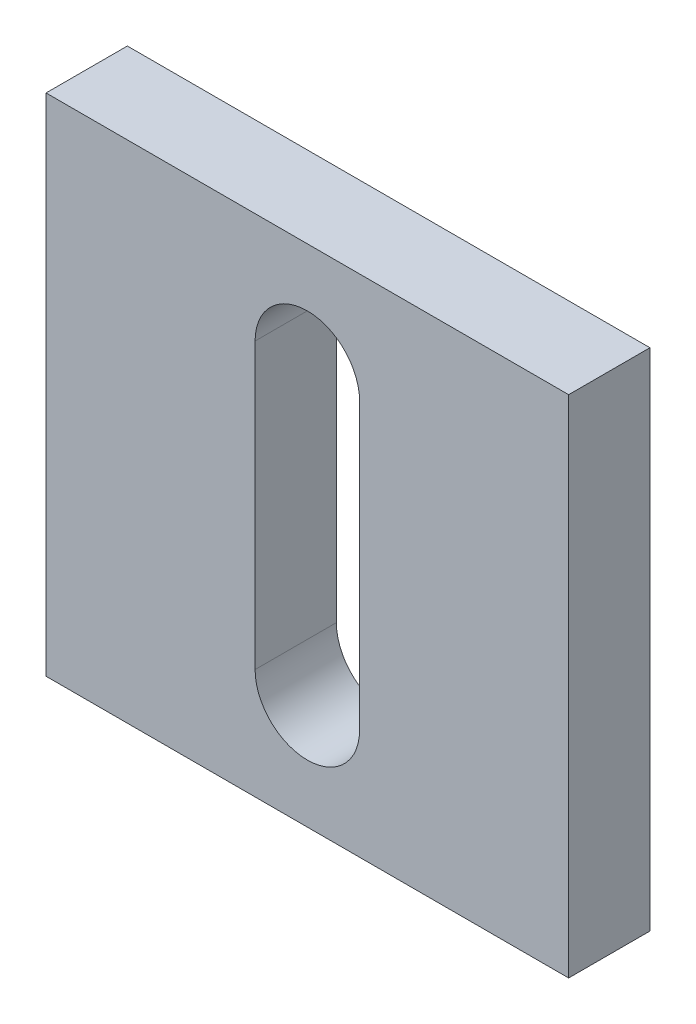
ISO-10303-21;
HEADER;
FILE_DESCRIPTION(('STEP AP214'),'2;1');
FILE_NAME('part.step','',(''),(''),'','','');
FILE_SCHEMA(('AUTOMOTIVE_DESIGN { 1 0 10303 214 1 1 1 1 }'));
ENDSEC;
DATA;
#1=APPLICATION_CONTEXT('core data for automotive mechanical design processes');
#2=APPLICATION_PROTOCOL_DEFINITION('international standard','automotive_design',2000,#1);
#3=PRODUCT_CONTEXT('',#1,'mechanical');
#4=PRODUCT('Part','Part','',(#3));
#5=PRODUCT_RELATED_PRODUCT_CATEGORY('part','',(#4));
#6=PRODUCT_DEFINITION_FORMATION('','',#4);
#7=PRODUCT_DEFINITION_CONTEXT('part definition',#1,'design');
#8=PRODUCT_DEFINITION('design','',#6,#7);
#9=PRODUCT_DEFINITION_SHAPE('','',#8);
#10=(LENGTH_UNIT() NAMED_UNIT(*) SI_UNIT(.MILLI.,.METRE.));
#11=(NAMED_UNIT(*) PLANE_ANGLE_UNIT() SI_UNIT($,.RADIAN.));
#12=(NAMED_UNIT(*) SI_UNIT($,.STERADIAN.) SOLID_ANGLE_UNIT());
#13=UNCERTAINTY_MEASURE_WITH_UNIT(LENGTH_MEASURE(1.E-05),#10,'distance_accuracy_value','');
#14=(GEOMETRIC_REPRESENTATION_CONTEXT(3) GLOBAL_UNCERTAINTY_ASSIGNED_CONTEXT((#13)) GLOBAL_UNIT_ASSIGNED_CONTEXT((#10,
#11,#12)) REPRESENTATION_CONTEXT('',''));
#15=CARTESIAN_POINT('',(0.,0.,0.));
#16=DIRECTION('',(0.,0.,1.));
#17=DIRECTION('',(1.,0.,0.));
#18=AXIS2_PLACEMENT_3D('',#15,#16,#17);
#19=CARTESIAN_POINT('',(0.,0.,14.));
#20=DIRECTION('',(1.,0.,0.));
#21=DIRECTION('',(0.,0.,-1.));
#22=AXIS2_PLACEMENT_3D('',#19,#20,#21);
#23=PLANE('',#22);
#24=DIRECTION('',(0.,-1.,0.));
#25=VECTOR('',#24,1.);
#26=CARTESIAN_POINT('',(0.,0.,0.));
#27=LINE('',#26,#25);
#28=CARTESIAN_POINT('',(0.,87.,0.));
#29=VERTEX_POINT('',#28);
#30=CARTESIAN_POINT('',(0.,0.,0.));
#31=VERTEX_POINT('',#30);
#32=EDGE_CURVE('E121',#29,#31,#27,.T.);
#33=ORIENTED_EDGE('',*,*,#32,.T.);
#34=DIRECTION('',(0.,0.,-1.));
#35=VECTOR('',#34,1.);
#36=CARTESIAN_POINT('',(0.,0.,14.));
#37=LINE('',#36,#35);
#38=CARTESIAN_POINT('',(0.,0.,14.));
#39=VERTEX_POINT('',#38);
#40=EDGE_CURVE('E150',#39,#31,#37,.T.);
#41=ORIENTED_EDGE('',*,*,#40,.F.);
#42=DIRECTION('',(0.,-1.,0.));
#43=VECTOR('',#42,1.);
#44=CARTESIAN_POINT('',(0.,0.,14.));
#45=LINE('',#44,#43);
#46=CARTESIAN_POINT('',(0.,87.,14.));
#47=VERTEX_POINT('',#46);
#48=EDGE_CURVE('E124',#47,#39,#45,.T.);
#49=ORIENTED_EDGE('',*,*,#48,.F.);
#50=DIRECTION('',(0.,0.,-1.));
#51=VECTOR('',#50,1.);
#52=CARTESIAN_POINT('',(0.,87.,14.));
#53=LINE('',#52,#51);
#54=EDGE_CURVE('E134',#47,#29,#53,.T.);
#55=ORIENTED_EDGE('',*,*,#54,.T.);
#56=EDGE_LOOP('',(#33,#41,#49,#55));
#57=FACE_BOUND('',#56,.T.);
#58=ADVANCED_FACE('F32',(#57),#23,.F.);
#59=CARTESIAN_POINT('',(0.,0.,14.));
#60=DIRECTION('',(0.,1.,0.));
#61=DIRECTION('',(0.,0.,1.));
#62=AXIS2_PLACEMENT_3D('',#59,#60,#61);
#63=PLANE('',#62);
#64=DIRECTION('',(1.,0.,0.));
#65=VECTOR('',#64,1.);
#66=CARTESIAN_POINT('',(0.,0.,0.));
#67=LINE('',#66,#65);
#68=CARTESIAN_POINT('',(90.,0.,0.));
#69=VERTEX_POINT('',#68);
#70=EDGE_CURVE('E137',#31,#69,#67,.T.);
#71=ORIENTED_EDGE('',*,*,#70,.T.);
#72=DIRECTION('',(0.,0.,-1.));
#73=VECTOR('',#72,1.);
#74=CARTESIAN_POINT('',(90.,0.,14.));
#75=LINE('',#74,#73);
#76=CARTESIAN_POINT('',(90.,0.,14.));
#77=VERTEX_POINT('',#76);
#78=EDGE_CURVE('E147',#77,#69,#75,.T.);
#79=ORIENTED_EDGE('',*,*,#78,.F.);
#80=DIRECTION('',(1.,0.,0.));
#81=VECTOR('',#80,1.);
#82=CARTESIAN_POINT('',(0.,0.,14.));
#83=LINE('',#82,#81);
#84=EDGE_CURVE('E127',#39,#77,#83,.T.);
#85=ORIENTED_EDGE('',*,*,#84,.F.);
#86=ORIENTED_EDGE('',*,*,#40,.T.);
#87=EDGE_LOOP('',(#71,#79,#85,#86));
#88=FACE_BOUND('',#87,.T.);
#89=ADVANCED_FACE('F175',(#88),#63,.F.);
#90=CARTESIAN_POINT('',(90.,87.,14.));
#91=DIRECTION('',(-1.,0.,0.));
#92=DIRECTION('',(0.,0.,1.));
#93=AXIS2_PLACEMENT_3D('',#90,#91,#92);
#94=PLANE('',#93);
#95=DIRECTION('',(0.,1.,0.));
#96=VECTOR('',#95,1.);
#97=CARTESIAN_POINT('',(90.,87.,0.));
#98=LINE('',#97,#96);
#99=CARTESIAN_POINT('',(90.,87.,0.));
#100=VERTEX_POINT('',#99);
#101=EDGE_CURVE('E139',#69,#100,#98,.T.);
#102=ORIENTED_EDGE('',*,*,#101,.T.);
#103=DIRECTION('',(0.,0.,-1.));
#104=VECTOR('',#103,1.);
#105=CARTESIAN_POINT('',(90.,87.,14.));
#106=LINE('',#105,#104);
#107=CARTESIAN_POINT('',(90.,87.,14.));
#108=VERTEX_POINT('',#107);
#109=EDGE_CURVE('E144',#108,#100,#106,.T.);
#110=ORIENTED_EDGE('',*,*,#109,.F.);
#111=DIRECTION('',(0.,1.,0.));
#112=VECTOR('',#111,1.);
#113=CARTESIAN_POINT('',(90.,87.,14.));
#114=LINE('',#113,#112);
#115=EDGE_CURVE('E130',#77,#108,#114,.T.);
#116=ORIENTED_EDGE('',*,*,#115,.F.);
#117=ORIENTED_EDGE('',*,*,#78,.T.);
#118=EDGE_LOOP('',(#102,#110,#116,#117));
#119=FACE_BOUND('',#118,.T.);
#120=ADVANCED_FACE('F180',(#119),#94,.F.);
#121=CARTESIAN_POINT('',(0.,87.,14.));
#122=DIRECTION('',(0.,-1.,0.));
#123=DIRECTION('',(0.,0.,-1.));
#124=AXIS2_PLACEMENT_3D('',#121,#122,#123);
#125=PLANE('',#124);
#126=DIRECTION('',(-1.,0.,0.));
#127=VECTOR('',#126,1.);
#128=CARTESIAN_POINT('',(0.,87.,0.));
#129=LINE('',#128,#127);
#130=EDGE_CURVE('E128',#100,#29,#129,.T.);
#131=ORIENTED_EDGE('',*,*,#130,.T.);
#132=ORIENTED_EDGE('',*,*,#54,.F.);
#133=DIRECTION('',(-1.,0.,0.));
#134=VECTOR('',#133,1.);
#135=CARTESIAN_POINT('',(0.,87.,14.));
#136=LINE('',#135,#134);
#137=EDGE_CURVE('E132',#108,#47,#136,.T.);
#138=ORIENTED_EDGE('',*,*,#137,.F.);
#139=ORIENTED_EDGE('',*,*,#109,.T.);
#140=EDGE_LOOP('',(#131,#132,#138,#139));
#141=FACE_BOUND('',#140,.T.);
#142=ADVANCED_FACE('F193',(#141),#125,.F.);
#143=CARTESIAN_POINT('',(0.,0.,14.));
#144=DIRECTION('',(0.,0.,-1.));
#145=DIRECTION('',(-1.,0.,0.));
#146=AXIS2_PLACEMENT_3D('',#143,#144,#145);
#147=PLANE('',#146);
#148=DIRECTION('',(0.,1.,0.));
#149=VECTOR('',#148,1.);
#150=CARTESIAN_POINT('',(54.,19.,14.));
#151=LINE('',#150,#149);
#152=CARTESIAN_POINT('',(54.,19.,14.));
#153=VERTEX_POINT('',#152);
#154=CARTESIAN_POINT('',(54.,68.,14.));
#155=VERTEX_POINT('',#154);
#156=EDGE_CURVE('E107',#153,#155,#151,.T.);
#157=ORIENTED_EDGE('',*,*,#156,.F.);
#158=CARTESIAN_POINT('',(45.,19.,14.));
#159=DIRECTION('',(0.,0.,1.));
#160=DIRECTION('',(1.,0.,0.));
#161=AXIS2_PLACEMENT_3D('',#158,#159,#160);
#162=CIRCLE('',#161,9.);
#163=CARTESIAN_POINT('',(36.,19.,14.));
#164=VERTEX_POINT('',#163);
#165=EDGE_CURVE('E46',#164,#153,#162,.T.);
#166=ORIENTED_EDGE('',*,*,#165,.F.);
#167=DIRECTION('',(0.,-1.,0.));
#168=VECTOR('',#167,1.);
#169=CARTESIAN_POINT('',(36.,68.,14.));
#170=LINE('',#169,#168);
#171=CARTESIAN_POINT('',(36.,68.,14.));
#172=VERTEX_POINT('',#171);
#173=EDGE_CURVE('E114',#172,#164,#170,.T.);
#174=ORIENTED_EDGE('',*,*,#173,.F.);
#175=CARTESIAN_POINT('',(45.,68.,14.));
#176=DIRECTION('',(0.,0.,1.));
#177=DIRECTION('',(1.,0.,0.));
#178=AXIS2_PLACEMENT_3D('',#175,#176,#177);
#179=CIRCLE('',#178,9.);
#180=EDGE_CURVE('E98',#155,#172,#179,.T.);
#181=ORIENTED_EDGE('',*,*,#180,.F.);
#182=EDGE_LOOP('',(#157,#166,#174,#181));
#183=FACE_BOUND('',#182,.T.);
#184=ORIENTED_EDGE('',*,*,#48,.T.);
#185=ORIENTED_EDGE('',*,*,#84,.T.);
#186=ORIENTED_EDGE('',*,*,#115,.T.);
#187=ORIENTED_EDGE('',*,*,#137,.T.);
#188=EDGE_LOOP('',(#184,#185,#186,#187));
#189=FACE_BOUND('',#188,.T.);
#190=ADVANCED_FACE('F111',(#183,#189),#147,.F.);
#191=CARTESIAN_POINT('',(0.,0.,0.));
#192=DIRECTION('',(0.,0.,-1.));
#193=DIRECTION('',(-1.,0.,0.));
#194=AXIS2_PLACEMENT_3D('',#191,#192,#193);
#195=PLANE('',#194);
#196=CARTESIAN_POINT('',(45.,19.,0.));
#197=DIRECTION('',(0.,0.,-1.));
#198=DIRECTION('',(-1.,0.,0.));
#199=AXIS2_PLACEMENT_3D('',#196,#197,#198);
#200=CIRCLE('',#199,9.);
#201=CARTESIAN_POINT('',(54.,19.,0.));
#202=VERTEX_POINT('',#201);
#203=CARTESIAN_POINT('',(36.,19.,0.));
#204=VERTEX_POINT('',#203);
#205=EDGE_CURVE('E11',#202,#204,#200,.T.);
#206=ORIENTED_EDGE('',*,*,#205,.F.);
#207=DIRECTION('',(0.,-1.,0.));
#208=VECTOR('',#207,1.);
#209=CARTESIAN_POINT('',(54.,0.,0.));
#210=LINE('',#209,#208);
#211=CARTESIAN_POINT('',(54.,68.,0.));
#212=VERTEX_POINT('',#211);
#213=EDGE_CURVE('E153',#212,#202,#210,.T.);
#214=ORIENTED_EDGE('',*,*,#213,.F.);
#215=CARTESIAN_POINT('',(45.,68.,0.));
#216=DIRECTION('',(0.,0.,-1.));
#217=DIRECTION('',(-1.,0.,0.));
#218=AXIS2_PLACEMENT_3D('',#215,#216,#217);
#219=CIRCLE('',#218,9.);
#220=CARTESIAN_POINT('',(36.,68.,0.));
#221=VERTEX_POINT('',#220);
#222=EDGE_CURVE('E101',#221,#212,#219,.T.);
#223=ORIENTED_EDGE('',*,*,#222,.F.);
#224=DIRECTION('',(0.,1.,0.));
#225=VECTOR('',#224,1.);
#226=CARTESIAN_POINT('',(36.,0.,0.));
#227=LINE('',#226,#225);
#228=EDGE_CURVE('E39',#204,#221,#227,.T.);
#229=ORIENTED_EDGE('',*,*,#228,.F.);
#230=EDGE_LOOP('',(#206,#214,#223,#229));
#231=FACE_BOUND('',#230,.T.);
#232=ORIENTED_EDGE('',*,*,#32,.F.);
#233=ORIENTED_EDGE('',*,*,#130,.F.);
#234=ORIENTED_EDGE('',*,*,#101,.F.);
#235=ORIENTED_EDGE('',*,*,#70,.F.);
#236=EDGE_LOOP('',(#232,#233,#234,#235));
#237=FACE_BOUND('',#236,.T.);
#238=ADVANCED_FACE('F161',(#231,#237),#195,.T.);
#239=CARTESIAN_POINT('',(45.,19.,-49.));
#240=DIRECTION('',(0.,0.,1.));
#241=DIRECTION('',(1.,0.,0.));
#242=AXIS2_PLACEMENT_3D('',#239,#240,#241);
#243=CYLINDRICAL_SURFACE('',#242,9.);
#244=ORIENTED_EDGE('',*,*,#205,.T.);
#245=DIRECTION('',(0.,0.,1.));
#246=VECTOR('',#245,1.);
#247=CARTESIAN_POINT('',(36.,19.,-49.));
#248=LINE('',#247,#246);
#249=EDGE_CURVE('E119',#204,#164,#248,.T.);
#250=ORIENTED_EDGE('',*,*,#249,.T.);
#251=ORIENTED_EDGE('',*,*,#165,.T.);
#252=DIRECTION('',(0.,0.,1.));
#253=VECTOR('',#252,1.);
#254=CARTESIAN_POINT('',(54.,19.,-49.));
#255=LINE('',#254,#253);
#256=EDGE_CURVE('E104',#202,#153,#255,.T.);
#257=ORIENTED_EDGE('',*,*,#256,.F.);
#258=EDGE_LOOP('',(#244,#250,#251,#257));
#259=FACE_BOUND('',#258,.T.);
#260=ADVANCED_FACE('F163',(#259),#243,.F.);
#261=CARTESIAN_POINT('',(36.,68.,-49.));
#262=DIRECTION('',(-1.,0.,0.));
#263=DIRECTION('',(0.,-1.,0.));
#264=AXIS2_PLACEMENT_3D('',#261,#262,#263);
#265=PLANE('',#264);
#266=ORIENTED_EDGE('',*,*,#228,.T.);
#267=DIRECTION('',(0.,0.,1.));
#268=VECTOR('',#267,1.);
#269=CARTESIAN_POINT('',(36.,68.,-49.));
#270=LINE('',#269,#268);
#271=EDGE_CURVE('E103',#221,#172,#270,.T.);
#272=ORIENTED_EDGE('',*,*,#271,.T.);
#273=ORIENTED_EDGE('',*,*,#173,.T.);
#274=ORIENTED_EDGE('',*,*,#249,.F.);
#275=EDGE_LOOP('',(#266,#272,#273,#274));
#276=FACE_BOUND('',#275,.T.);
#277=ADVANCED_FACE('F158',(#276),#265,.F.);
#278=CARTESIAN_POINT('',(45.,68.,-49.));
#279=DIRECTION('',(0.,0.,1.));
#280=DIRECTION('',(1.,0.,0.));
#281=AXIS2_PLACEMENT_3D('',#278,#279,#280);
#282=CYLINDRICAL_SURFACE('',#281,9.);
#283=ORIENTED_EDGE('',*,*,#222,.T.);
#284=DIRECTION('',(0.,0.,1.));
#285=VECTOR('',#284,1.);
#286=CARTESIAN_POINT('',(54.,68.,-49.));
#287=LINE('',#286,#285);
#288=EDGE_CURVE('E54',#212,#155,#287,.T.);
#289=ORIENTED_EDGE('',*,*,#288,.T.);
#290=ORIENTED_EDGE('',*,*,#180,.T.);
#291=ORIENTED_EDGE('',*,*,#271,.F.);
#292=EDGE_LOOP('',(#283,#289,#290,#291));
#293=FACE_BOUND('',#292,.T.);
#294=ADVANCED_FACE('F95',(#293),#282,.F.);
#295=CARTESIAN_POINT('',(54.,19.,-49.));
#296=DIRECTION('',(1.,0.,0.));
#297=DIRECTION('',(0.,1.,0.));
#298=AXIS2_PLACEMENT_3D('',#295,#296,#297);
#299=PLANE('',#298);
#300=ORIENTED_EDGE('',*,*,#213,.T.);
#301=ORIENTED_EDGE('',*,*,#256,.T.);
#302=ORIENTED_EDGE('',*,*,#156,.T.);
#303=ORIENTED_EDGE('',*,*,#288,.F.);
#304=EDGE_LOOP('',(#300,#301,#302,#303));
#305=FACE_BOUND('',#304,.T.);
#306=ADVANCED_FACE('F108',(#305),#299,.F.);
#307=CLOSED_SHELL('',(#58,#89,#120,#142,#190,#238,#260,#277,#294,#306));
#308=MANIFOLD_SOLID_BREP('B2',#307);
#309=ADVANCED_BREP_SHAPE_REPRESENTATION('',(#18,#308),#14);
#310=SHAPE_DEFINITION_REPRESENTATION(#9,#309);
ENDSEC;
END-ISO-10303-21;
